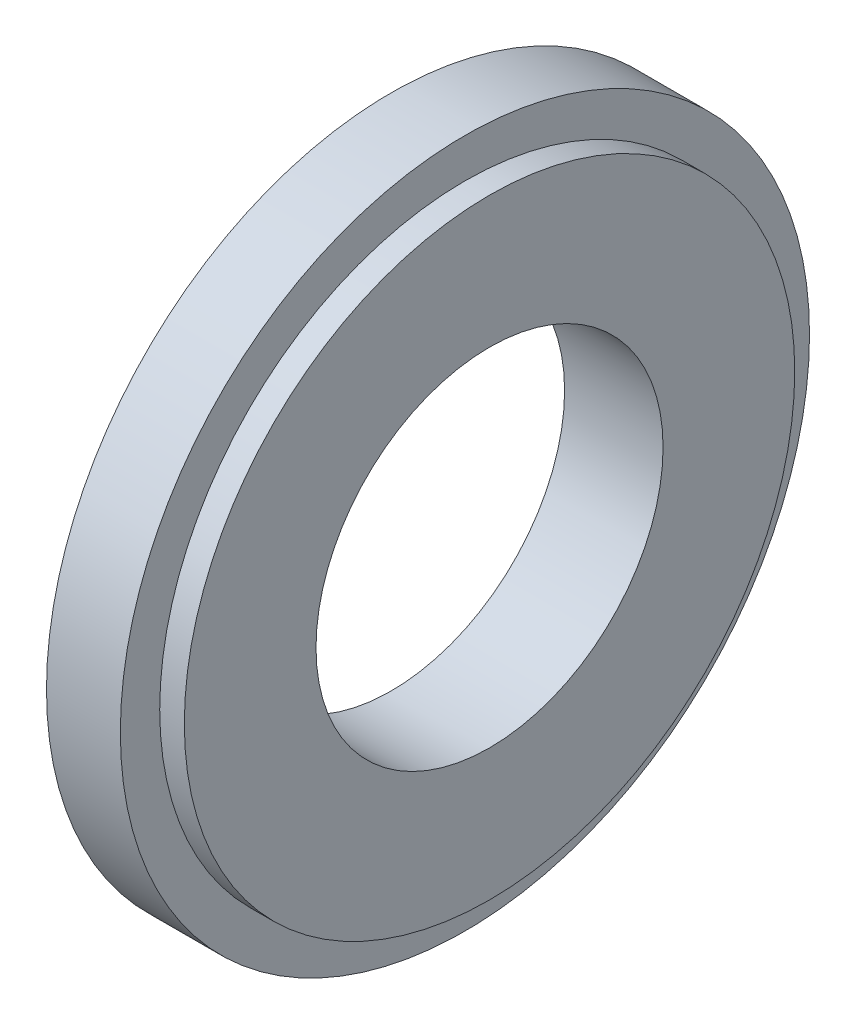
ISO-10303-21;
HEADER;
FILE_DESCRIPTION(('STEP AP214'),'2;1');
FILE_NAME('part.step','',(''),(''),'','','');
FILE_SCHEMA(('AUTOMOTIVE_DESIGN { 1 0 10303 214 1 1 1 1 }'));
ENDSEC;
DATA;
#1=APPLICATION_CONTEXT('core data for automotive mechanical design processes');
#2=APPLICATION_PROTOCOL_DEFINITION('international standard','automotive_design',2000,#1);
#3=PRODUCT_CONTEXT('',#1,'mechanical');
#4=PRODUCT('Part','Part','',(#3));
#5=PRODUCT_RELATED_PRODUCT_CATEGORY('part','',(#4));
#6=PRODUCT_DEFINITION_FORMATION('','',#4);
#7=PRODUCT_DEFINITION_CONTEXT('part definition',#1,'design');
#8=PRODUCT_DEFINITION('design','',#6,#7);
#9=PRODUCT_DEFINITION_SHAPE('','',#8);
#10=(LENGTH_UNIT() NAMED_UNIT(*) SI_UNIT(.MILLI.,.METRE.));
#11=(NAMED_UNIT(*) PLANE_ANGLE_UNIT() SI_UNIT($,.RADIAN.));
#12=(NAMED_UNIT(*) SI_UNIT($,.STERADIAN.) SOLID_ANGLE_UNIT());
#13=UNCERTAINTY_MEASURE_WITH_UNIT(LENGTH_MEASURE(1.E-05),#10,'distance_accuracy_value','');
#14=(GEOMETRIC_REPRESENTATION_CONTEXT(3) GLOBAL_UNCERTAINTY_ASSIGNED_CONTEXT((#13)) GLOBAL_UNIT_ASSIGNED_CONTEXT((#10,
#11,#12)) REPRESENTATION_CONTEXT('',''));
#15=CARTESIAN_POINT('',(0.,0.,0.));
#16=DIRECTION('',(0.,0.,1.));
#17=DIRECTION('',(1.,0.,0.));
#18=AXIS2_PLACEMENT_3D('',#15,#16,#17);
#19=CARTESIAN_POINT('',(-100.302885933672,0.,0.));
#20=DIRECTION('',(1.,0.,0.));
#21=DIRECTION('',(0.,0.,-1.));
#22=AXIS2_PLACEMENT_3D('',#19,#20,#21);
#23=PLANE('',#22);
#24=CARTESIAN_POINT('',(-100.302885933672,0.,0.));
#25=DIRECTION('',(1.,0.,0.));
#26=DIRECTION('',(0.,0.,-1.));
#27=AXIS2_PLACEMENT_3D('',#24,#25,#26);
#28=CIRCLE('',#27,35.25);
#29=CARTESIAN_POINT('',(-100.302885933672,0.,-35.25));
#30=VERTEX_POINT('',#29);
#31=EDGE_CURVE('E81',#30,#30,#28,.T.);
#32=ORIENTED_EDGE('',*,*,#31,.T.);
#33=EDGE_LOOP('',(#32));
#34=FACE_BOUND('',#33,.T.);
#35=CARTESIAN_POINT('',(-100.302885933672,0.,0.));
#36=DIRECTION('',(-1.,0.,0.));
#37=DIRECTION('',(0.,0.,1.));
#38=AXIS2_PLACEMENT_3D('',#35,#36,#37);
#39=CIRCLE('',#38,70.);
#40=CARTESIAN_POINT('',(-100.302885933672,0.,70.));
#41=VERTEX_POINT('',#40);
#42=EDGE_CURVE('E12',#41,#41,#39,.T.);
#43=ORIENTED_EDGE('',*,*,#42,.T.);
#44=EDGE_LOOP('',(#43));
#45=FACE_BOUND('',#44,.T.);
#46=ADVANCED_FACE('F57',(#34,#45),#23,.F.);
#47=CARTESIAN_POINT('',(0.,0.,0.));
#48=DIRECTION('',(-1.,0.,0.));
#49=DIRECTION('',(0.,0.,1.));
#50=AXIS2_PLACEMENT_3D('',#47,#48,#49);
#51=CYLINDRICAL_SURFACE('',#50,70.);
#52=ORIENTED_EDGE('',*,*,#42,.F.);
#53=EDGE_LOOP('',(#52));
#54=FACE_BOUND('',#53,.T.);
#55=CARTESIAN_POINT('',(-85.3028859336723,0.,0.));
#56=DIRECTION('',(-1.,0.,0.));
#57=DIRECTION('',(0.,0.,1.));
#58=AXIS2_PLACEMENT_3D('',#55,#56,#57);
#59=CIRCLE('',#58,70.);
#60=CARTESIAN_POINT('',(-85.3028859336723,0.,70.));
#61=VERTEX_POINT('',#60);
#62=EDGE_CURVE('E65',#61,#61,#59,.T.);
#63=ORIENTED_EDGE('',*,*,#62,.T.);
#64=EDGE_LOOP('',(#63));
#65=FACE_BOUND('',#64,.T.);
#66=ADVANCED_FACE('F106',(#54,#65),#51,.T.);
#67=CARTESIAN_POINT('',(-85.3028859336723,70.,0.));
#68=DIRECTION('',(-1.,0.,0.));
#69=DIRECTION('',(0.,0.,1.));
#70=AXIS2_PLACEMENT_3D('',#67,#68,#69);
#71=PLANE('',#70);
#72=ORIENTED_EDGE('',*,*,#62,.F.);
#73=EDGE_LOOP('',(#72));
#74=FACE_BOUND('',#73,.T.);
#75=CARTESIAN_POINT('',(-85.3028859336723,0.,0.));
#76=DIRECTION('',(-1.,0.,0.));
#77=DIRECTION('',(0.,0.,1.));
#78=AXIS2_PLACEMENT_3D('',#75,#76,#77);
#79=CIRCLE('',#78,62.);
#80=CARTESIAN_POINT('',(-85.3028859336723,0.,62.));
#81=VERTEX_POINT('',#80);
#82=EDGE_CURVE('E71',#81,#81,#79,.T.);
#83=ORIENTED_EDGE('',*,*,#82,.T.);
#84=EDGE_LOOP('',(#83));
#85=FACE_BOUND('',#84,.T.);
#86=ADVANCED_FACE('F111',(#74,#85),#71,.F.);
#87=CARTESIAN_POINT('',(0.,0.,0.));
#88=DIRECTION('',(-1.,0.,0.));
#89=DIRECTION('',(0.,0.,1.));
#90=AXIS2_PLACEMENT_3D('',#87,#88,#89);
#91=CYLINDRICAL_SURFACE('',#90,62.);
#92=ORIENTED_EDGE('',*,*,#82,.F.);
#93=EDGE_LOOP('',(#92));
#94=FACE_BOUND('',#93,.T.);
#95=CARTESIAN_POINT('',(-80.3028859336723,0.,0.));
#96=DIRECTION('',(-1.,0.,0.));
#97=DIRECTION('',(0.,0.,1.));
#98=AXIS2_PLACEMENT_3D('',#95,#96,#97);
#99=CIRCLE('',#98,62.);
#100=CARTESIAN_POINT('',(-80.3028859336723,0.,62.));
#101=VERTEX_POINT('',#100);
#102=EDGE_CURVE('E77',#101,#101,#99,.T.);
#103=ORIENTED_EDGE('',*,*,#102,.T.);
#104=EDGE_LOOP('',(#103));
#105=FACE_BOUND('',#104,.T.);
#106=ADVANCED_FACE('F103',(#94,#105),#91,.T.);
#107=CARTESIAN_POINT('',(-80.3028859336723,62.0000000000001,0.));
#108=DIRECTION('',(-1.,0.,0.));
#109=DIRECTION('',(0.,0.,1.));
#110=AXIS2_PLACEMENT_3D('',#107,#108,#109);
#111=PLANE('',#110);
#112=CARTESIAN_POINT('',(-80.3028859336723,0.,0.));
#113=DIRECTION('',(-1.,0.,0.));
#114=DIRECTION('',(0.,0.,1.));
#115=AXIS2_PLACEMENT_3D('',#112,#113,#114);
#116=CIRCLE('',#115,35.25);
#117=CARTESIAN_POINT('',(-80.3028859336723,0.,35.25));
#118=VERTEX_POINT('',#117);
#119=EDGE_CURVE('E60',#118,#118,#116,.T.);
#120=ORIENTED_EDGE('',*,*,#119,.T.);
#121=EDGE_LOOP('',(#120));
#122=FACE_BOUND('',#121,.T.);
#123=ORIENTED_EDGE('',*,*,#102,.F.);
#124=EDGE_LOOP('',(#123));
#125=FACE_BOUND('',#124,.T.);
#126=ADVANCED_FACE('F92',(#122,#125),#111,.F.);
#127=CARTESIAN_POINT('',(-100.302885933672,0.,0.));
#128=DIRECTION('',(1.,0.,0.));
#129=DIRECTION('',(0.,0.,-1.));
#130=AXIS2_PLACEMENT_3D('',#127,#128,#129);
#131=CYLINDRICAL_SURFACE('',#130,35.25);
#132=ORIENTED_EDGE('',*,*,#31,.F.);
#133=EDGE_LOOP('',(#132));
#134=FACE_BOUND('',#133,.T.);
#135=ORIENTED_EDGE('',*,*,#119,.F.);
#136=EDGE_LOOP('',(#135));
#137=FACE_BOUND('',#136,.T.);
#138=ADVANCED_FACE('F95',(#134,#137),#131,.F.);
#139=CLOSED_SHELL('',(#46,#66,#86,#106,#126,#138));
#140=MANIFOLD_SOLID_BREP('B2',#139);
#141=ADVANCED_BREP_SHAPE_REPRESENTATION('',(#18,#140),#14);
#142=SHAPE_DEFINITION_REPRESENTATION(#9,#141);
ENDSEC;
END-ISO-10303-21;
